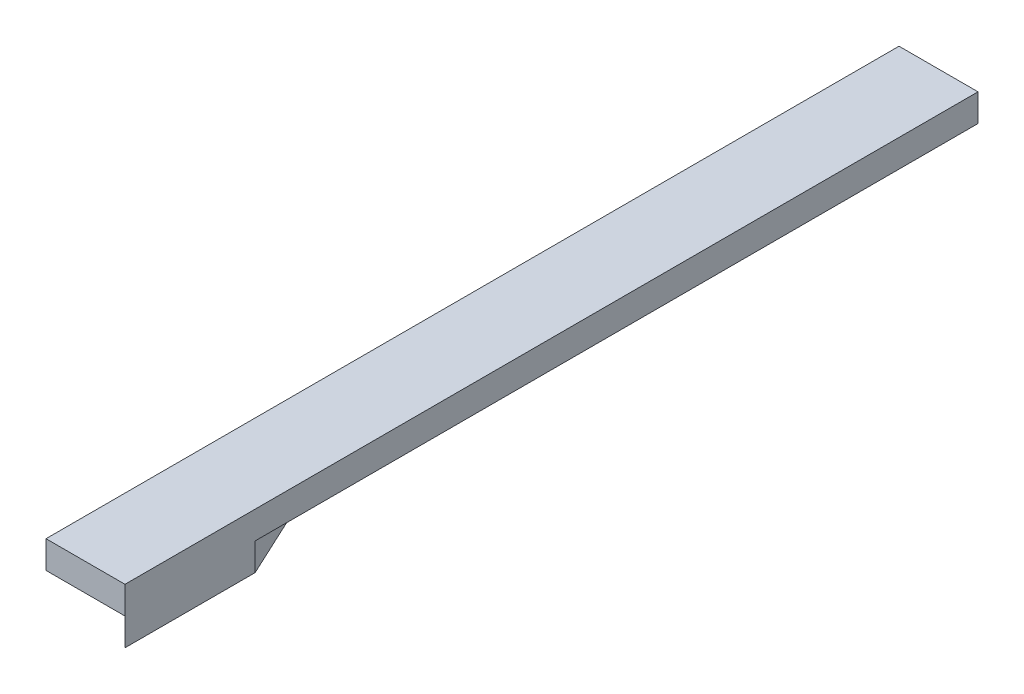
ISO-10303-21;
HEADER;
FILE_DESCRIPTION(('STEP AP214'),'2;1');
FILE_NAME('part.step','',(''),(''),'','','');
FILE_SCHEMA(('AUTOMOTIVE_DESIGN { 1 0 10303 214 1 1 1 1 }'));
ENDSEC;
DATA;
#1=APPLICATION_CONTEXT('core data for automotive mechanical design processes');
#2=APPLICATION_PROTOCOL_DEFINITION('international standard','automotive_design',2000,#1);
#3=PRODUCT_CONTEXT('',#1,'mechanical');
#4=PRODUCT('Part','Part','',(#3));
#5=PRODUCT_RELATED_PRODUCT_CATEGORY('part','',(#4));
#6=PRODUCT_DEFINITION_FORMATION('','',#4);
#7=PRODUCT_DEFINITION_CONTEXT('part definition',#1,'design');
#8=PRODUCT_DEFINITION('design','',#6,#7);
#9=PRODUCT_DEFINITION_SHAPE('','',#8);
#10=(LENGTH_UNIT() NAMED_UNIT(*) SI_UNIT(.MILLI.,.METRE.));
#11=(NAMED_UNIT(*) PLANE_ANGLE_UNIT() SI_UNIT($,.RADIAN.));
#12=(NAMED_UNIT(*) SI_UNIT($,.STERADIAN.) SOLID_ANGLE_UNIT());
#13=UNCERTAINTY_MEASURE_WITH_UNIT(LENGTH_MEASURE(1.E-05),#10,'distance_accuracy_value','');
#14=(GEOMETRIC_REPRESENTATION_CONTEXT(3) GLOBAL_UNCERTAINTY_ASSIGNED_CONTEXT((#13)) GLOBAL_UNIT_ASSIGNED_CONTEXT((#10,
#11,#12)) REPRESENTATION_CONTEXT('',''));
#15=CARTESIAN_POINT('',(0.,0.,0.));
#16=DIRECTION('',(0.,0.,1.));
#17=DIRECTION('',(1.,0.,0.));
#18=AXIS2_PLACEMENT_3D('',#15,#16,#17);
#19=CARTESIAN_POINT('',(0.,0.,0.));
#20=DIRECTION('',(0.,1.,0.));
#21=DIRECTION('',(0.,0.,1.));
#22=AXIS2_PLACEMENT_3D('',#19,#20,#21);
#23=PLANE('',#22);
#24=DIRECTION('',(0.,0.,1.));
#25=VECTOR('',#24,1.);
#26=CARTESIAN_POINT('',(14.3596718209954,0.,0.));
#27=LINE('',#26,#25);
#28=CARTESIAN_POINT('',(14.3596718209954,0.,0.));
#29=VERTEX_POINT('',#28);
#30=CARTESIAN_POINT('',(14.3596718209954,0.,131.428974956594));
#31=VERTEX_POINT('',#30);
#32=EDGE_CURVE('E176',#29,#31,#27,.T.);
#33=ORIENTED_EDGE('',*,*,#32,.T.);
#34=DIRECTION('',(-0.422618261740697,0.,-0.906307787036651));
#35=VECTOR('',#34,1.);
#36=CARTESIAN_POINT('',(-38.5452724918128,0.,17.9739557486034));
#37=LINE('',#36,#35);
#38=CARTESIAN_POINT('',(0.,0.,100.634559360223));
#39=VERTEX_POINT('',#38);
#40=EDGE_CURVE('E114',#31,#39,#37,.T.);
#41=ORIENTED_EDGE('',*,*,#40,.T.);
#42=DIRECTION('',(0.,0.,1.));
#43=VECTOR('',#42,1.);
#44=CARTESIAN_POINT('',(0.,0.,0.));
#45=LINE('',#44,#43);
#46=CARTESIAN_POINT('',(0.,0.,0.));
#47=VERTEX_POINT('',#46);
#48=EDGE_CURVE('E169',#47,#39,#45,.T.);
#49=ORIENTED_EDGE('',*,*,#48,.F.);
#50=DIRECTION('',(1.,0.,0.));
#51=VECTOR('',#50,1.);
#52=CARTESIAN_POINT('',(0.,0.,0.));
#53=LINE('',#52,#51);
#54=EDGE_CURVE('E159',#47,#29,#53,.T.);
#55=ORIENTED_EDGE('',*,*,#54,.T.);
#56=EDGE_LOOP('',(#33,#41,#49,#55));
#57=FACE_BOUND('',#56,.T.);
#58=ADVANCED_FACE('F39',(#57),#23,.F.);
#59=CARTESIAN_POINT('',(0.,5.,0.));
#60=DIRECTION('',(1.,0.,0.));
#61=DIRECTION('',(0.,0.,-1.));
#62=AXIS2_PLACEMENT_3D('',#59,#60,#61);
#63=PLANE('',#62);
#64=ORIENTED_EDGE('',*,*,#48,.T.);
#65=DIRECTION('',(0.,1.,0.));
#66=VECTOR('',#65,1.);
#67=CARTESIAN_POINT('',(0.,-5.,100.634559360223));
#68=LINE('',#67,#66);
#69=CARTESIAN_POINT('',(0.,-5.,100.634559360223));
#70=VERTEX_POINT('',#69);
#71=EDGE_CURVE('E118',#70,#39,#68,.T.);
#72=ORIENTED_EDGE('',*,*,#71,.F.);
#73=DIRECTION('',(0.,0.,1.));
#74=VECTOR('',#73,1.);
#75=CARTESIAN_POINT('',(0.,-5.,0.));
#76=LINE('',#75,#74);
#77=CARTESIAN_POINT('',(0.,-5.,124.296575191748));
#78=VERTEX_POINT('',#77);
#79=EDGE_CURVE('E135',#70,#78,#76,.T.);
#80=ORIENTED_EDGE('',*,*,#79,.T.);
#81=DIRECTION('',(0.,1.,0.));
#82=VECTOR('',#81,1.);
#83=CARTESIAN_POINT('',(0.,-5.,124.296575191748));
#84=LINE('',#83,#82);
#85=CARTESIAN_POINT('',(0.,0.,124.296575191748));
#86=VERTEX_POINT('',#85);
#87=EDGE_CURVE('E151',#78,#86,#84,.T.);
#88=ORIENTED_EDGE('',*,*,#87,.T.);
#89=CARTESIAN_POINT('',(0.,0.,155.090990788119));
#90=VERTEX_POINT('',#89);
#91=EDGE_CURVE('E150',#86,#90,#45,.T.);
#92=ORIENTED_EDGE('',*,*,#91,.T.);
#93=DIRECTION('',(0.,-1.,0.));
#94=VECTOR('',#93,1.);
#95=CARTESIAN_POINT('',(0.,5.,155.090990788119));
#96=LINE('',#95,#94);
#97=CARTESIAN_POINT('',(0.,5.,155.090990788119));
#98=VERTEX_POINT('',#97);
#99=EDGE_CURVE('E11',#98,#90,#96,.T.);
#100=ORIENTED_EDGE('',*,*,#99,.F.);
#101=DIRECTION('',(0.,0.,1.));
#102=VECTOR('',#101,1.);
#103=CARTESIAN_POINT('',(0.,5.,0.));
#104=LINE('',#103,#102);
#105=CARTESIAN_POINT('',(0.,5.,0.));
#106=VERTEX_POINT('',#105);
#107=EDGE_CURVE('E156',#106,#98,#104,.T.);
#108=ORIENTED_EDGE('',*,*,#107,.F.);
#109=DIRECTION('',(0.,-1.,0.));
#110=VECTOR('',#109,1.);
#111=CARTESIAN_POINT('',(0.,5.,0.));
#112=LINE('',#111,#110);
#113=EDGE_CURVE('E57',#106,#47,#112,.T.);
#114=ORIENTED_EDGE('',*,*,#113,.T.);
#115=EDGE_LOOP('',(#64,#72,#80,#88,#92,#100,#108,#114));
#116=FACE_BOUND('',#115,.T.);
#117=ADVANCED_FACE('F41',(#116),#63,.F.);
#118=CARTESIAN_POINT('',(0.,5.,155.090990788119));
#119=DIRECTION('',(0.,0.,-1.));
#120=DIRECTION('',(-1.,0.,0.));
#121=AXIS2_PLACEMENT_3D('',#118,#119,#120);
#122=PLANE('',#121);
#123=DIRECTION('',(1.,0.,0.));
#124=VECTOR('',#123,1.);
#125=CARTESIAN_POINT('',(0.,0.,155.090990788119));
#126=LINE('',#125,#124);
#127=CARTESIAN_POINT('',(14.3596718209954,0.,155.090990788119));
#128=VERTEX_POINT('',#127);
#129=EDGE_CURVE('E172',#90,#128,#126,.T.);
#130=ORIENTED_EDGE('',*,*,#129,.T.);
#131=DIRECTION('',(0.,-1.,0.));
#132=VECTOR('',#131,1.);
#133=CARTESIAN_POINT('',(14.3596718209954,5.,155.090990788119));
#134=LINE('',#133,#132);
#135=CARTESIAN_POINT('',(14.3596718209954,5.,155.090990788119));
#136=VERTEX_POINT('',#135);
#137=EDGE_CURVE('E49',#136,#128,#134,.T.);
#138=ORIENTED_EDGE('',*,*,#137,.F.);
#139=DIRECTION('',(1.,0.,0.));
#140=VECTOR('',#139,1.);
#141=CARTESIAN_POINT('',(0.,5.,155.090990788119));
#142=LINE('',#141,#140);
#143=EDGE_CURVE('E83',#98,#136,#142,.T.);
#144=ORIENTED_EDGE('',*,*,#143,.F.);
#145=ORIENTED_EDGE('',*,*,#99,.T.);
#146=EDGE_LOOP('',(#130,#138,#144,#145));
#147=FACE_BOUND('',#146,.T.);
#148=ADVANCED_FACE('F188',(#147),#122,.F.);
#149=CARTESIAN_POINT('',(14.3596718209954,5.,0.));
#150=DIRECTION('',(1.,0.,0.));
#151=DIRECTION('',(0.,0.,-1.));
#152=AXIS2_PLACEMENT_3D('',#149,#150,#151);
#153=PLANE('',#152);
#154=ORIENTED_EDGE('',*,*,#32,.F.);
#155=DIRECTION('',(0.,-1.,0.));
#156=VECTOR('',#155,1.);
#157=CARTESIAN_POINT('',(14.3596718209954,5.,0.));
#158=LINE('',#157,#156);
#159=CARTESIAN_POINT('',(14.3596718209954,5.,0.));
#160=VERTEX_POINT('',#159);
#161=EDGE_CURVE('E72',#160,#29,#158,.T.);
#162=ORIENTED_EDGE('',*,*,#161,.F.);
#163=DIRECTION('',(0.,0.,1.));
#164=VECTOR('',#163,1.);
#165=CARTESIAN_POINT('',(14.3596718209954,5.,0.));
#166=LINE('',#165,#164);
#167=EDGE_CURVE('E162',#160,#136,#166,.T.);
#168=ORIENTED_EDGE('',*,*,#167,.T.);
#169=ORIENTED_EDGE('',*,*,#137,.T.);
#170=DIRECTION('',(0.,1.,0.));
#171=VECTOR('',#170,1.);
#172=CARTESIAN_POINT('',(14.3596718209954,-5.,155.090990788119));
#173=LINE('',#172,#171);
#174=CARTESIAN_POINT('',(14.3596718209954,-5.,155.090990788119));
#175=VERTEX_POINT('',#174);
#176=EDGE_CURVE('E125',#175,#128,#173,.T.);
#177=ORIENTED_EDGE('',*,*,#176,.F.);
#178=DIRECTION('',(0.,0.,1.));
#179=VECTOR('',#178,1.);
#180=CARTESIAN_POINT('',(14.3596718209954,-5.,0.));
#181=LINE('',#180,#179);
#182=CARTESIAN_POINT('',(14.3596718209954,-5.,131.428974956594));
#183=VERTEX_POINT('',#182);
#184=EDGE_CURVE('E122',#183,#175,#181,.T.);
#185=ORIENTED_EDGE('',*,*,#184,.F.);
#186=DIRECTION('',(0.,1.,0.));
#187=VECTOR('',#186,1.);
#188=CARTESIAN_POINT('',(14.3596718209954,-5.,131.428974956594));
#189=LINE('',#188,#187);
#190=EDGE_CURVE('E108',#183,#31,#189,.T.);
#191=ORIENTED_EDGE('',*,*,#190,.T.);
#192=EDGE_LOOP('',(#154,#162,#168,#169,#177,#185,#191));
#193=FACE_BOUND('',#192,.T.);
#194=ADVANCED_FACE('F123',(#193),#153,.T.);
#195=CARTESIAN_POINT('',(0.,5.,0.));
#196=DIRECTION('',(0.,0.,-1.));
#197=DIRECTION('',(-1.,0.,0.));
#198=AXIS2_PLACEMENT_3D('',#195,#196,#197);
#199=PLANE('',#198);
#200=ORIENTED_EDGE('',*,*,#54,.F.);
#201=ORIENTED_EDGE('',*,*,#113,.F.);
#202=DIRECTION('',(1.,0.,0.));
#203=VECTOR('',#202,1.);
#204=CARTESIAN_POINT('',(0.,5.,0.));
#205=LINE('',#204,#203);
#206=EDGE_CURVE('E166',#106,#160,#205,.T.);
#207=ORIENTED_EDGE('',*,*,#206,.T.);
#208=ORIENTED_EDGE('',*,*,#161,.T.);
#209=EDGE_LOOP('',(#200,#201,#207,#208));
#210=FACE_BOUND('',#209,.T.);
#211=ADVANCED_FACE('F200',(#210),#199,.T.);
#212=CARTESIAN_POINT('',(0.,5.,0.));
#213=DIRECTION('',(0.,1.,0.));
#214=DIRECTION('',(0.,0.,1.));
#215=AXIS2_PLACEMENT_3D('',#212,#213,#214);
#216=PLANE('',#215);
#217=ORIENTED_EDGE('',*,*,#107,.T.);
#218=ORIENTED_EDGE('',*,*,#143,.T.);
#219=ORIENTED_EDGE('',*,*,#167,.F.);
#220=ORIENTED_EDGE('',*,*,#206,.F.);
#221=EDGE_LOOP('',(#217,#218,#219,#220));
#222=FACE_BOUND('',#221,.T.);
#223=ADVANCED_FACE('F199',(#222),#216,.T.);
#224=ORIENTED_EDGE('',*,*,#91,.F.);
#225=DIRECTION('',(0.422618261740697,0.,0.906307787036651));
#226=VECTOR('',#225,1.);
#227=CARTESIAN_POINT('',(-47.6083503621793,0.,22.2001383660103));
#228=LINE('',#227,#226);
#229=EDGE_CURVE('E130',#86,#128,#228,.T.);
#230=ORIENTED_EDGE('',*,*,#229,.T.);
#231=ORIENTED_EDGE('',*,*,#129,.F.);
#232=EDGE_LOOP('',(#224,#230,#231));
#233=FACE_BOUND('',#232,.T.);
#234=ADVANCED_FACE('F192',(#233),#23,.F.);
#235=CARTESIAN_POINT('',(-47.6083503621793,-5.,22.2001383660103));
#236=DIRECTION('',(-0.906307787036651,0.,0.422618261740697));
#237=DIRECTION('',(0.422618261740697,0.,0.906307787036651));
#238=AXIS2_PLACEMENT_3D('',#235,#236,#237);
#239=PLANE('',#238);
#240=ORIENTED_EDGE('',*,*,#229,.F.);
#241=ORIENTED_EDGE('',*,*,#87,.F.);
#242=DIRECTION('',(0.422618261740697,0.,0.906307787036651));
#243=VECTOR('',#242,1.);
#244=CARTESIAN_POINT('',(-47.6083503621793,-5.,22.2001383660103));
#245=LINE('',#244,#243);
#246=EDGE_CURVE('E119',#78,#175,#245,.T.);
#247=ORIENTED_EDGE('',*,*,#246,.T.);
#248=ORIENTED_EDGE('',*,*,#176,.T.);
#249=EDGE_LOOP('',(#240,#241,#247,#248));
#250=FACE_BOUND('',#249,.T.);
#251=ADVANCED_FACE('F195',(#250),#239,.T.);
#252=CARTESIAN_POINT('',(-38.5452724918128,-5.,17.9739557486034));
#253=DIRECTION('',(0.906307787036651,0.,-0.422618261740697));
#254=DIRECTION('',(-0.422618261740697,0.,-0.906307787036651));
#255=AXIS2_PLACEMENT_3D('',#252,#253,#254);
#256=PLANE('',#255);
#257=ORIENTED_EDGE('',*,*,#40,.F.);
#258=ORIENTED_EDGE('',*,*,#190,.F.);
#259=DIRECTION('',(-0.422618261740697,0.,-0.906307787036651));
#260=VECTOR('',#259,1.);
#261=CARTESIAN_POINT('',(-38.5452724918128,-5.,17.9739557486034));
#262=LINE('',#261,#260);
#263=EDGE_CURVE('E112',#183,#70,#262,.T.);
#264=ORIENTED_EDGE('',*,*,#263,.T.);
#265=ORIENTED_EDGE('',*,*,#71,.T.);
#266=EDGE_LOOP('',(#257,#258,#264,#265));
#267=FACE_BOUND('',#266,.T.);
#268=ADVANCED_FACE('F110',(#267),#256,.T.);
#269=CARTESIAN_POINT('',(0.,-5.,0.));
#270=DIRECTION('',(0.,1.,0.));
#271=DIRECTION('',(0.,0.,1.));
#272=AXIS2_PLACEMENT_3D('',#269,#270,#271);
#273=PLANE('',#272);
#274=ORIENTED_EDGE('',*,*,#184,.T.);
#275=ORIENTED_EDGE('',*,*,#246,.F.);
#276=ORIENTED_EDGE('',*,*,#79,.F.);
#277=ORIENTED_EDGE('',*,*,#263,.F.);
#278=EDGE_LOOP('',(#274,#275,#276,#277));
#279=FACE_BOUND('',#278,.T.);
#280=ADVANCED_FACE('F133',(#279),#273,.F.);
#281=CLOSED_SHELL('',(#58,#117,#148,#194,#211,#223,#234,#251,#268,#280));
#282=MANIFOLD_SOLID_BREP('B2',#281);
#283=ADVANCED_BREP_SHAPE_REPRESENTATION('',(#18,#282),#14);
#284=SHAPE_DEFINITION_REPRESENTATION(#9,#283);
ENDSEC;
END-ISO-10303-21;
